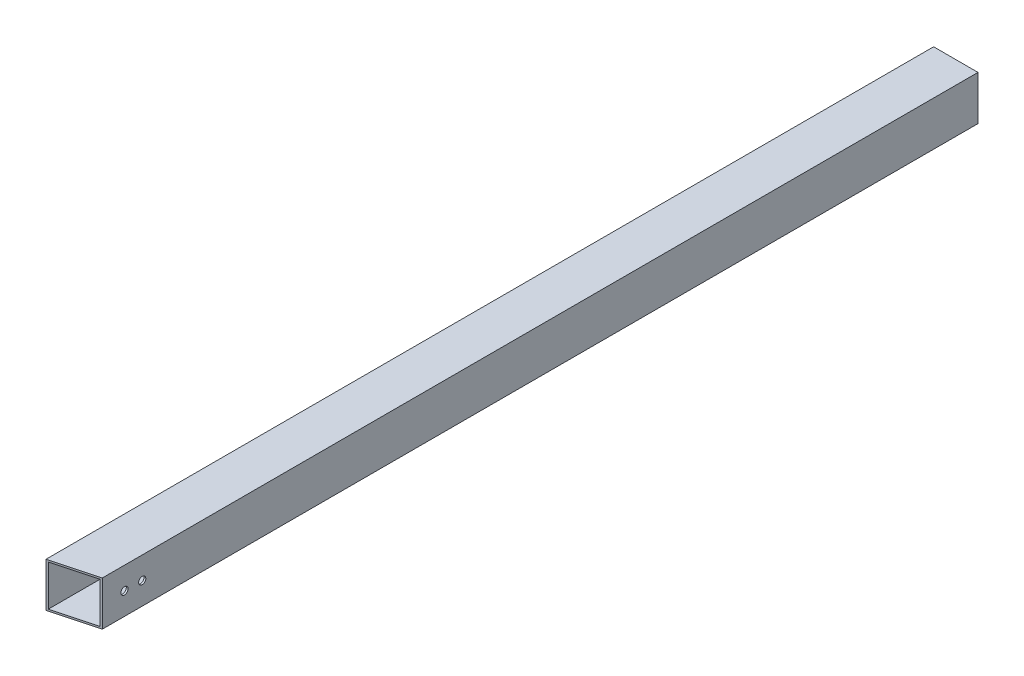
ISO-10303-21;
HEADER;
FILE_DESCRIPTION(('STEP AP214'),'2;1');
FILE_NAME('part.step','',(''),(''),'','','');
FILE_SCHEMA(('AUTOMOTIVE_DESIGN { 1 0 10303 214 1 1 1 1 }'));
ENDSEC;
DATA;
#1=APPLICATION_CONTEXT('core data for automotive mechanical design processes');
#2=APPLICATION_PROTOCOL_DEFINITION('international standard','automotive_design',2000,#1);
#3=PRODUCT_CONTEXT('',#1,'mechanical');
#4=PRODUCT('Part','Part','',(#3));
#5=PRODUCT_RELATED_PRODUCT_CATEGORY('part','',(#4));
#6=PRODUCT_DEFINITION_FORMATION('','',#4);
#7=PRODUCT_DEFINITION_CONTEXT('part definition',#1,'design');
#8=PRODUCT_DEFINITION('design','',#6,#7);
#9=PRODUCT_DEFINITION_SHAPE('','',#8);
#10=(LENGTH_UNIT() NAMED_UNIT(*) SI_UNIT(.MILLI.,.METRE.));
#11=(NAMED_UNIT(*) PLANE_ANGLE_UNIT() SI_UNIT($,.RADIAN.));
#12=(NAMED_UNIT(*) SI_UNIT($,.STERADIAN.) SOLID_ANGLE_UNIT());
#13=UNCERTAINTY_MEASURE_WITH_UNIT(LENGTH_MEASURE(1.E-05),#10,'distance_accuracy_value','');
#14=(GEOMETRIC_REPRESENTATION_CONTEXT(3) GLOBAL_UNCERTAINTY_ASSIGNED_CONTEXT((#13)) GLOBAL_UNIT_ASSIGNED_CONTEXT((#10,
#11,#12)) REPRESENTATION_CONTEXT('',''));
#15=CARTESIAN_POINT('',(0.,0.,0.));
#16=DIRECTION('',(0.,0.,1.));
#17=DIRECTION('',(1.,0.,0.));
#18=AXIS2_PLACEMENT_3D('',#15,#16,#17);
#19=CARTESIAN_POINT('',(-51.,0.,1893.205080758));
#20=DIRECTION('',(1.,0.,0.));
#21=DIRECTION('',(0.,0.,1.));
#22=AXIS2_PLACEMENT_3D('',#19,#20,#21);
#23=CYLINDRICAL_SURFACE('',#22,8.1);
#24=DIRECTION('',(1.,0.,0.));
#25=VECTOR('',#24,1.);
#26=CARTESIAN_POINT('',(-51.,0.,1901.305080758));
#27=LINE('',#26,#25);
#28=CARTESIAN_POINT('',(46.,0.,1901.305080758));
#29=VERTEX_POINT('',#28);
#30=CARTESIAN_POINT('',(50.,0.,1901.305080758));
#31=VERTEX_POINT('',#30);
#32=EDGE_CURVE('E11',#29,#31,#27,.T.);
#33=ORIENTED_EDGE('',*,*,#32,.F.);
#34=CARTESIAN_POINT('',(46.,0.,1893.205080758));
#35=DIRECTION('',(1.,0.,0.));
#36=DIRECTION('',(0.,0.,1.));
#37=AXIS2_PLACEMENT_3D('',#34,#35,#36);
#38=CIRCLE('',#37,8.1);
#39=EDGE_CURVE('E194',#29,#29,#38,.T.);
#40=ORIENTED_EDGE('',*,*,#39,.F.);
#41=ORIENTED_EDGE('',*,*,#32,.T.);
#42=CARTESIAN_POINT('',(50.,0.,1893.205080758));
#43=DIRECTION('',(1.,0.,0.));
#44=DIRECTION('',(0.,0.,1.));
#45=AXIS2_PLACEMENT_3D('',#42,#43,#44);
#46=CIRCLE('',#45,8.1);
#47=EDGE_CURVE('E204',#31,#31,#46,.T.);
#48=ORIENTED_EDGE('',*,*,#47,.T.);
#49=EDGE_LOOP('',(#33,#40,#41,#48));
#50=FACE_BOUND('',#49,.T.);
#51=ADVANCED_FACE('F17',(#50),#23,.F.);
#52=CARTESIAN_POINT('',(-51.,0.,1933.205080758));
#53=DIRECTION('',(1.,0.,0.));
#54=DIRECTION('',(0.,0.,1.));
#55=AXIS2_PLACEMENT_3D('',#52,#53,#54);
#56=CYLINDRICAL_SURFACE('',#55,8.1);
#57=DIRECTION('',(1.,0.,0.));
#58=VECTOR('',#57,1.);
#59=CARTESIAN_POINT('',(-51.,0.,1941.305080758));
#60=LINE('',#59,#58);
#61=CARTESIAN_POINT('',(46.,0.,1941.305080758));
#62=VERTEX_POINT('',#61);
#63=CARTESIAN_POINT('',(50.,0.,1941.305080758));
#64=VERTEX_POINT('',#63);
#65=EDGE_CURVE('E26',#62,#64,#60,.T.);
#66=ORIENTED_EDGE('',*,*,#65,.F.);
#67=CARTESIAN_POINT('',(46.,0.,1933.205080758));
#68=DIRECTION('',(1.,0.,0.));
#69=DIRECTION('',(0.,0.,1.));
#70=AXIS2_PLACEMENT_3D('',#67,#68,#69);
#71=CIRCLE('',#70,8.1);
#72=EDGE_CURVE('E198',#62,#62,#71,.T.);
#73=ORIENTED_EDGE('',*,*,#72,.F.);
#74=ORIENTED_EDGE('',*,*,#65,.T.);
#75=CARTESIAN_POINT('',(50.,0.,1933.205080758));
#76=DIRECTION('',(1.,0.,0.));
#77=DIRECTION('',(0.,0.,1.));
#78=AXIS2_PLACEMENT_3D('',#75,#76,#77);
#79=CIRCLE('',#78,8.1);
#80=EDGE_CURVE('E147',#64,#64,#79,.T.);
#81=ORIENTED_EDGE('',*,*,#80,.T.);
#82=EDGE_LOOP('',(#66,#73,#74,#81));
#83=FACE_BOUND('',#82,.T.);
#84=ADVANCED_FACE('F235',(#83),#56,.F.);
#85=CARTESIAN_POINT('',(-51.,0.,1893.205080758));
#86=DIRECTION('',(1.,0.,0.));
#87=DIRECTION('',(0.,0.,1.));
#88=AXIS2_PLACEMENT_3D('',#85,#86,#87);
#89=CYLINDRICAL_SURFACE('',#88,8.1);
#90=DIRECTION('',(1.,0.,0.));
#91=VECTOR('',#90,1.);
#92=CARTESIAN_POINT('',(-51.,0.,1901.305080758));
#93=LINE('',#92,#91);
#94=CARTESIAN_POINT('',(-50.,0.,1901.305080758));
#95=VERTEX_POINT('',#94);
#96=CARTESIAN_POINT('',(-46.,0.,1901.305080758));
#97=VERTEX_POINT('',#96);
#98=EDGE_CURVE('E231',#95,#97,#93,.T.);
#99=ORIENTED_EDGE('',*,*,#98,.F.);
#100=CARTESIAN_POINT('',(-50.,0.,1893.205080758));
#101=DIRECTION('',(1.,0.,0.));
#102=DIRECTION('',(0.,0.,1.));
#103=AXIS2_PLACEMENT_3D('',#100,#101,#102);
#104=CIRCLE('',#103,8.1);
#105=EDGE_CURVE('E164',#95,#95,#104,.T.);
#106=ORIENTED_EDGE('',*,*,#105,.F.);
#107=ORIENTED_EDGE('',*,*,#98,.T.);
#108=CARTESIAN_POINT('',(-46.,0.,1893.205080758));
#109=DIRECTION('',(1.,0.,0.));
#110=DIRECTION('',(0.,0.,1.));
#111=AXIS2_PLACEMENT_3D('',#108,#109,#110);
#112=CIRCLE('',#111,8.1);
#113=EDGE_CURVE('E217',#97,#97,#112,.T.);
#114=ORIENTED_EDGE('',*,*,#113,.T.);
#115=EDGE_LOOP('',(#99,#106,#107,#114));
#116=FACE_BOUND('',#115,.T.);
#117=ADVANCED_FACE('F316',(#116),#89,.F.);
#118=CARTESIAN_POINT('',(-51.,0.,1933.205080758));
#119=DIRECTION('',(1.,0.,0.));
#120=DIRECTION('',(0.,0.,1.));
#121=AXIS2_PLACEMENT_3D('',#118,#119,#120);
#122=CYLINDRICAL_SURFACE('',#121,8.1);
#123=DIRECTION('',(1.,0.,0.));
#124=VECTOR('',#123,1.);
#125=CARTESIAN_POINT('',(-51.,0.,1941.305080758));
#126=LINE('',#125,#124);
#127=CARTESIAN_POINT('',(-50.,0.,1941.305080758));
#128=VERTEX_POINT('',#127);
#129=CARTESIAN_POINT('',(-46.,0.,1941.305080758));
#130=VERTEX_POINT('',#129);
#131=EDGE_CURVE('E197',#128,#130,#126,.T.);
#132=ORIENTED_EDGE('',*,*,#131,.F.);
#133=CARTESIAN_POINT('',(-50.,0.,1933.205080758));
#134=DIRECTION('',(1.,0.,0.));
#135=DIRECTION('',(0.,0.,1.));
#136=AXIS2_PLACEMENT_3D('',#133,#134,#135);
#137=CIRCLE('',#136,8.1);
#138=EDGE_CURVE('E171',#128,#128,#137,.T.);
#139=ORIENTED_EDGE('',*,*,#138,.F.);
#140=ORIENTED_EDGE('',*,*,#131,.T.);
#141=CARTESIAN_POINT('',(-46.,0.,1933.205080758));
#142=DIRECTION('',(1.,0.,0.));
#143=DIRECTION('',(0.,0.,1.));
#144=AXIS2_PLACEMENT_3D('',#141,#142,#143);
#145=CIRCLE('',#144,8.1);
#146=EDGE_CURVE('E213',#130,#130,#145,.T.);
#147=ORIENTED_EDGE('',*,*,#146,.T.);
#148=EDGE_LOOP('',(#132,#139,#140,#147));
#149=FACE_BOUND('',#148,.T.);
#150=ADVANCED_FACE('F323',(#149),#122,.F.);
#151=CARTESIAN_POINT('',(-46.,-46.,10.));
#152=DIRECTION('',(0.,1.,0.));
#153=DIRECTION('',(1.,0.,0.));
#154=AXIS2_PLACEMENT_3D('',#151,#152,#153);
#155=PLANE('',#154);
#156=DIRECTION('',(1.,0.,0.));
#157=VECTOR('',#156,1.);
#158=CARTESIAN_POINT('',(-46.,-46.,10.));
#159=LINE('',#158,#157);
#160=CARTESIAN_POINT('',(-46.,-46.,10.));
#161=VERTEX_POINT('',#160);
#162=CARTESIAN_POINT('',(46.,-46.,10.));
#163=VERTEX_POINT('',#162);
#164=EDGE_CURVE('E253',#161,#163,#159,.T.);
#165=ORIENTED_EDGE('',*,*,#164,.F.);
#166=DIRECTION('',(0.,0.,1.));
#167=VECTOR('',#166,1.);
#168=CARTESIAN_POINT('',(-46.,-46.,10.));
#169=LINE('',#168,#167);
#170=CARTESIAN_POINT('',(-46.,-46.,2008.928203232));
#171=VERTEX_POINT('',#170);
#172=EDGE_CURVE('E210',#161,#171,#169,.T.);
#173=ORIENTED_EDGE('',*,*,#172,.T.);
#174=DIRECTION('',(-0.965925826288944,0.,0.258819045102985));
#175=VECTOR('',#174,1.);
#176=CARTESIAN_POINT('',(222.98373972776,-46.,1936.854227395));
#177=LINE('',#176,#175);
#178=CARTESIAN_POINT('',(46.,-46.,1984.276877529));
#179=VERTEX_POINT('',#178);
#180=EDGE_CURVE('E190',#179,#171,#177,.T.);
#181=ORIENTED_EDGE('',*,*,#180,.F.);
#182=DIRECTION('',(0.,0.,1.));
#183=VECTOR('',#182,1.);
#184=CARTESIAN_POINT('',(46.,-46.,10.));
#185=LINE('',#184,#183);
#186=EDGE_CURVE('E224',#163,#179,#185,.T.);
#187=ORIENTED_EDGE('',*,*,#186,.F.);
#188=EDGE_LOOP('',(#165,#173,#181,#187));
#189=FACE_BOUND('',#188,.T.);
#190=ADVANCED_FACE('F19',(#189),#155,.T.);
#191=CARTESIAN_POINT('',(46.,-46.,10.));
#192=DIRECTION('',(-1.,0.,0.));
#193=DIRECTION('',(0.,0.,1.));
#194=AXIS2_PLACEMENT_3D('',#191,#192,#193);
#195=PLANE('',#194);
#196=ORIENTED_EDGE('',*,*,#39,.T.);
#197=EDGE_LOOP('',(#196));
#198=FACE_BOUND('',#197,.T.);
#199=ORIENTED_EDGE('',*,*,#72,.T.);
#200=EDGE_LOOP('',(#199));
#201=FACE_BOUND('',#200,.T.);
#202=DIRECTION('',(0.,1.,0.));
#203=VECTOR('',#202,1.);
#204=CARTESIAN_POINT('',(46.,-46.,10.));
#205=LINE('',#204,#203);
#206=CARTESIAN_POINT('',(46.,46.,10.));
#207=VERTEX_POINT('',#206);
#208=EDGE_CURVE('E245',#163,#207,#205,.T.);
#209=ORIENTED_EDGE('',*,*,#208,.F.);
#210=ORIENTED_EDGE('',*,*,#186,.T.);
#211=DIRECTION('',(0.,-1.,0.));
#212=VECTOR('',#211,1.);
#213=CARTESIAN_POINT('',(46.,-23.,1984.276877529));
#214=LINE('',#213,#212);
#215=CARTESIAN_POINT('',(46.,46.,1984.276877529));
#216=VERTEX_POINT('',#215);
#217=EDGE_CURVE('E186',#216,#179,#214,.T.);
#218=ORIENTED_EDGE('',*,*,#217,.F.);
#219=DIRECTION('',(0.,0.,1.));
#220=VECTOR('',#219,1.);
#221=CARTESIAN_POINT('',(46.,46.,10.));
#222=LINE('',#221,#220);
#223=EDGE_CURVE('E221',#207,#216,#222,.T.);
#224=ORIENTED_EDGE('',*,*,#223,.F.);
#225=EDGE_LOOP('',(#209,#210,#218,#224));
#226=FACE_BOUND('',#225,.T.);
#227=ADVANCED_FACE('F238',(#198,#201,#226),#195,.T.);
#228=CARTESIAN_POINT('',(46.,46.,10.));
#229=DIRECTION('',(0.,-1.,0.));
#230=DIRECTION('',(0.,0.,-1.));
#231=AXIS2_PLACEMENT_3D('',#228,#229,#230);
#232=PLANE('',#231);
#233=DIRECTION('',(-1.,0.,0.));
#234=VECTOR('',#233,1.);
#235=CARTESIAN_POINT('',(46.,46.,10.));
#236=LINE('',#235,#234);
#237=CARTESIAN_POINT('',(-46.,46.,10.));
#238=VERTEX_POINT('',#237);
#239=EDGE_CURVE('E175',#207,#238,#236,.T.);
#240=ORIENTED_EDGE('',*,*,#239,.F.);
#241=ORIENTED_EDGE('',*,*,#223,.T.);
#242=DIRECTION('',(0.965925826288944,0.,-0.258819045102985));
#243=VECTOR('',#242,1.);
#244=CARTESIAN_POINT('',(265.90232401481,46.,1925.354227395));
#245=LINE('',#244,#243);
#246=CARTESIAN_POINT('',(-46.,46.,2008.928203232));
#247=VERTEX_POINT('',#246);
#248=EDGE_CURVE('E158',#247,#216,#245,.T.);
#249=ORIENTED_EDGE('',*,*,#248,.F.);
#250=DIRECTION('',(0.,0.,1.));
#251=VECTOR('',#250,1.);
#252=CARTESIAN_POINT('',(-46.,46.,10.));
#253=LINE('',#252,#251);
#254=EDGE_CURVE('E207',#238,#247,#253,.T.);
#255=ORIENTED_EDGE('',*,*,#254,.F.);
#256=EDGE_LOOP('',(#240,#241,#249,#255));
#257=FACE_BOUND('',#256,.T.);
#258=ADVANCED_FACE('F241',(#257),#232,.T.);
#259=CARTESIAN_POINT('',(-46.,46.,10.));
#260=DIRECTION('',(1.,0.,0.));
#261=DIRECTION('',(0.,1.,0.));
#262=AXIS2_PLACEMENT_3D('',#259,#260,#261);
#263=PLANE('',#262);
#264=ORIENTED_EDGE('',*,*,#113,.F.);
#265=EDGE_LOOP('',(#264));
#266=FACE_BOUND('',#265,.T.);
#267=ORIENTED_EDGE('',*,*,#146,.F.);
#268=EDGE_LOOP('',(#267));
#269=FACE_BOUND('',#268,.T.);
#270=DIRECTION('',(0.,-1.,0.));
#271=VECTOR('',#270,1.);
#272=CARTESIAN_POINT('',(-46.,46.,10.));
#273=LINE('',#272,#271);
#274=EDGE_CURVE('E179',#238,#161,#273,.T.);
#275=ORIENTED_EDGE('',*,*,#274,.F.);
#276=ORIENTED_EDGE('',*,*,#254,.T.);
#277=DIRECTION('',(0.,1.,0.));
#278=VECTOR('',#277,1.);
#279=CARTESIAN_POINT('',(-46.,23.,2008.928203232));
#280=LINE('',#279,#278);
#281=EDGE_CURVE('E148',#171,#247,#280,.T.);
#282=ORIENTED_EDGE('',*,*,#281,.F.);
#283=ORIENTED_EDGE('',*,*,#172,.F.);
#284=EDGE_LOOP('',(#275,#276,#282,#283));
#285=FACE_BOUND('',#284,.T.);
#286=ADVANCED_FACE('F294',(#266,#269,#285),#263,.T.);
#287=CARTESIAN_POINT('',(50.,50.,10.));
#288=DIRECTION('',(0.,-1.,0.));
#289=DIRECTION('',(0.,0.,-1.));
#290=AXIS2_PLACEMENT_3D('',#287,#288,#289);
#291=PLANE('',#290);
#292=DIRECTION('',(0.,0.,1.));
#293=VECTOR('',#292,1.);
#294=CARTESIAN_POINT('',(-50.,50.,10.));
#295=LINE('',#294,#293);
#296=CARTESIAN_POINT('',(-50.,50.,10.));
#297=VERTEX_POINT('',#296);
#298=CARTESIAN_POINT('',(-50.,50.,2010.000000002));
#299=VERTEX_POINT('',#298);
#300=EDGE_CURVE('E161',#297,#299,#295,.T.);
#301=ORIENTED_EDGE('',*,*,#300,.T.);
#302=DIRECTION('',(0.965925826288944,0.,-0.258819045102985));
#303=VECTOR('',#302,1.);
#304=CARTESIAN_POINT('',(267.76834941859,50.,1924.854227395));
#305=LINE('',#304,#303);
#306=CARTESIAN_POINT('',(50.,50.,1983.205080759));
#307=VERTEX_POINT('',#306);
#308=EDGE_CURVE('E152',#299,#307,#305,.T.);
#309=ORIENTED_EDGE('',*,*,#308,.T.);
#310=DIRECTION('',(0.,0.,1.));
#311=VECTOR('',#310,1.);
#312=CARTESIAN_POINT('',(50.,50.,10.));
#313=LINE('',#312,#311);
#314=CARTESIAN_POINT('',(50.,50.,10.));
#315=VERTEX_POINT('',#314);
#316=EDGE_CURVE('E135',#315,#307,#313,.T.);
#317=ORIENTED_EDGE('',*,*,#316,.F.);
#318=DIRECTION('',(-1.,0.,0.));
#319=VECTOR('',#318,1.);
#320=CARTESIAN_POINT('',(50.,50.,10.));
#321=LINE('',#320,#319);
#322=EDGE_CURVE('E265',#315,#297,#321,.T.);
#323=ORIENTED_EDGE('',*,*,#322,.T.);
#324=EDGE_LOOP('',(#301,#309,#317,#323));
#325=FACE_BOUND('',#324,.T.);
#326=ADVANCED_FACE('F160',(#325),#291,.F.);
#327=CARTESIAN_POINT('',(50.,-50.,10.));
#328=DIRECTION('',(-1.,0.,0.));
#329=DIRECTION('',(0.,0.,1.));
#330=AXIS2_PLACEMENT_3D('',#327,#328,#329);
#331=PLANE('',#330);
#332=ORIENTED_EDGE('',*,*,#47,.F.);
#333=EDGE_LOOP('',(#332));
#334=FACE_BOUND('',#333,.T.);
#335=ORIENTED_EDGE('',*,*,#80,.F.);
#336=EDGE_LOOP('',(#335));
#337=FACE_BOUND('',#336,.T.);
#338=ORIENTED_EDGE('',*,*,#316,.T.);
#339=DIRECTION('',(0.,-1.,0.));
#340=VECTOR('',#339,1.);
#341=CARTESIAN_POINT('',(50.,-25.,1983.205080759));
#342=LINE('',#341,#340);
#343=CARTESIAN_POINT('',(50.,-50.,1983.205080759));
#344=VERTEX_POINT('',#343);
#345=EDGE_CURVE('E139',#307,#344,#342,.T.);
#346=ORIENTED_EDGE('',*,*,#345,.T.);
#347=DIRECTION('',(0.,0.,1.));
#348=VECTOR('',#347,1.);
#349=CARTESIAN_POINT('',(50.,-50.,10.));
#350=LINE('',#349,#348);
#351=CARTESIAN_POINT('',(50.,-50.,10.));
#352=VERTEX_POINT('',#351);
#353=EDGE_CURVE('E283',#352,#344,#350,.T.);
#354=ORIENTED_EDGE('',*,*,#353,.F.);
#355=DIRECTION('',(0.,1.,0.));
#356=VECTOR('',#355,1.);
#357=CARTESIAN_POINT('',(50.,-50.,10.));
#358=LINE('',#357,#356);
#359=EDGE_CURVE('E141',#352,#315,#358,.T.);
#360=ORIENTED_EDGE('',*,*,#359,.T.);
#361=EDGE_LOOP('',(#338,#346,#354,#360));
#362=FACE_BOUND('',#361,.T.);
#363=ADVANCED_FACE('F137',(#334,#337,#362),#331,.F.);
#364=CARTESIAN_POINT('',(-7.764571352508,0.,1998.683051004));
#365=DIRECTION('',(-0.258819045102985,0.,-0.965925826288944));
#366=DIRECTION('',(-0.965925826288944,0.,0.258819045102985));
#367=AXIS2_PLACEMENT_3D('',#364,#365,#366);
#368=PLANE('',#367);
#369=ORIENTED_EDGE('',*,*,#248,.T.);
#370=ORIENTED_EDGE('',*,*,#217,.T.);
#371=ORIENTED_EDGE('',*,*,#180,.T.);
#372=ORIENTED_EDGE('',*,*,#281,.T.);
#373=EDGE_LOOP('',(#369,#370,#371,#372));
#374=FACE_BOUND('',#373,.T.);
#375=ORIENTED_EDGE('',*,*,#308,.F.);
#376=DIRECTION('',(0.,1.,0.));
#377=VECTOR('',#376,1.);
#378=CARTESIAN_POINT('',(-50.,25.,2010.000000002));
#379=LINE('',#378,#377);
#380=CARTESIAN_POINT('',(-50.,-50.,2010.000000002));
#381=VERTEX_POINT('',#380);
#382=EDGE_CURVE('E177',#381,#299,#379,.T.);
#383=ORIENTED_EDGE('',*,*,#382,.F.);
#384=DIRECTION('',(-0.965925826288944,0.,0.258819045102985));
#385=VECTOR('',#384,1.);
#386=CARTESIAN_POINT('',(221.11771432398,-50.,1937.354227395));
#387=LINE('',#386,#385);
#388=EDGE_CURVE('E155',#344,#381,#387,.T.);
#389=ORIENTED_EDGE('',*,*,#388,.F.);
#390=ORIENTED_EDGE('',*,*,#345,.F.);
#391=EDGE_LOOP('',(#375,#383,#389,#390));
#392=FACE_BOUND('',#391,.T.);
#393=ADVANCED_FACE('F151',(#374,#392),#368,.F.);
#394=CARTESIAN_POINT('',(-50.,50.,10.));
#395=DIRECTION('',(1.,0.,0.));
#396=DIRECTION('',(0.,1.,0.));
#397=AXIS2_PLACEMENT_3D('',#394,#395,#396);
#398=PLANE('',#397);
#399=ORIENTED_EDGE('',*,*,#105,.T.);
#400=EDGE_LOOP('',(#399));
#401=FACE_BOUND('',#400,.T.);
#402=ORIENTED_EDGE('',*,*,#138,.T.);
#403=EDGE_LOOP('',(#402));
#404=FACE_BOUND('',#403,.T.);
#405=DIRECTION('',(0.,0.,1.));
#406=VECTOR('',#405,1.);
#407=CARTESIAN_POINT('',(-50.,-50.,10.));
#408=LINE('',#407,#406);
#409=CARTESIAN_POINT('',(-50.,-50.,10.));
#410=VERTEX_POINT('',#409);
#411=EDGE_CURVE('E275',#410,#381,#408,.T.);
#412=ORIENTED_EDGE('',*,*,#411,.T.);
#413=ORIENTED_EDGE('',*,*,#382,.T.);
#414=ORIENTED_EDGE('',*,*,#300,.F.);
#415=DIRECTION('',(0.,-1.,0.));
#416=VECTOR('',#415,1.);
#417=CARTESIAN_POINT('',(-50.,50.,10.));
#418=LINE('',#417,#416);
#419=EDGE_CURVE('E271',#297,#410,#418,.T.);
#420=ORIENTED_EDGE('',*,*,#419,.T.);
#421=EDGE_LOOP('',(#412,#413,#414,#420));
#422=FACE_BOUND('',#421,.T.);
#423=ADVANCED_FACE('F297',(#401,#404,#422),#398,.F.);
#424=CARTESIAN_POINT('',(0.,0.,10.));
#425=DIRECTION('',(0.,0.,1.));
#426=DIRECTION('',(1.,0.,0.));
#427=AXIS2_PLACEMENT_3D('',#424,#425,#426);
#428=PLANE('',#427);
#429=ORIENTED_EDGE('',*,*,#164,.T.);
#430=ORIENTED_EDGE('',*,*,#208,.T.);
#431=ORIENTED_EDGE('',*,*,#239,.T.);
#432=ORIENTED_EDGE('',*,*,#274,.T.);
#433=EDGE_LOOP('',(#429,#430,#431,#432));
#434=FACE_BOUND('',#433,.T.);
#435=ORIENTED_EDGE('',*,*,#419,.F.);
#436=ORIENTED_EDGE('',*,*,#322,.F.);
#437=ORIENTED_EDGE('',*,*,#359,.F.);
#438=DIRECTION('',(1.,0.,0.));
#439=VECTOR('',#438,1.);
#440=CARTESIAN_POINT('',(-50.,-50.,10.));
#441=LINE('',#440,#439);
#442=EDGE_CURVE('E274',#410,#352,#441,.T.);
#443=ORIENTED_EDGE('',*,*,#442,.F.);
#444=EDGE_LOOP('',(#435,#436,#437,#443));
#445=FACE_BOUND('',#444,.T.);
#446=ADVANCED_FACE('F256',(#434,#445),#428,.F.);
#447=CARTESIAN_POINT('',(-50.,-50.,10.));
#448=DIRECTION('',(0.,1.,0.));
#449=DIRECTION('',(1.,0.,0.));
#450=AXIS2_PLACEMENT_3D('',#447,#448,#449);
#451=PLANE('',#450);
#452=ORIENTED_EDGE('',*,*,#353,.T.);
#453=ORIENTED_EDGE('',*,*,#388,.T.);
#454=ORIENTED_EDGE('',*,*,#411,.F.);
#455=ORIENTED_EDGE('',*,*,#442,.T.);
#456=EDGE_LOOP('',(#452,#453,#454,#455));
#457=FACE_BOUND('',#456,.T.);
#458=ADVANCED_FACE('F393',(#457),#451,.F.);
#459=CLOSED_SHELL('',(#51,#84,#117,#150,#190,#227,#258,#286,#326,#363,#393,#423,#446,#458));
#460=MANIFOLD_SOLID_BREP('B1',#459);
#461=ADVANCED_BREP_SHAPE_REPRESENTATION('',(#18,#460),#14);
#462=SHAPE_DEFINITION_REPRESENTATION(#9,#461);
ENDSEC;
END-ISO-10303-21;
